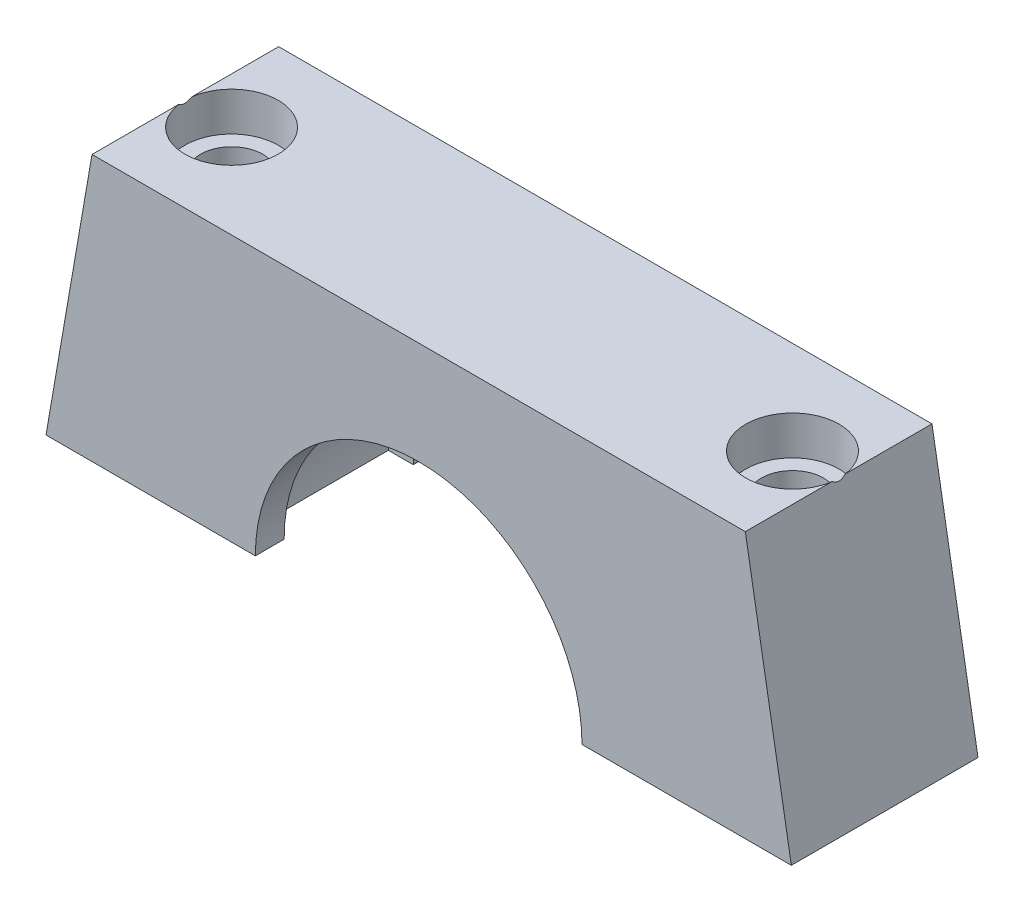
ISO-10303-21;
HEADER;
FILE_DESCRIPTION(('STEP AP214'),'2;1');
FILE_NAME('part.step','',(''),(''),'','','');
FILE_SCHEMA(('AUTOMOTIVE_DESIGN { 1 0 10303 214 1 1 1 1 }'));
ENDSEC;
DATA;
#1=APPLICATION_CONTEXT('core data for automotive mechanical design processes');
#2=APPLICATION_PROTOCOL_DEFINITION('international standard','automotive_design',2000,#1);
#3=PRODUCT_CONTEXT('',#1,'mechanical');
#4=PRODUCT('Part','Part','',(#3));
#5=PRODUCT_RELATED_PRODUCT_CATEGORY('part','',(#4));
#6=PRODUCT_DEFINITION_FORMATION('','',#4);
#7=PRODUCT_DEFINITION_CONTEXT('part definition',#1,'design');
#8=PRODUCT_DEFINITION('design','',#6,#7);
#9=PRODUCT_DEFINITION_SHAPE('','',#8);
#10=(LENGTH_UNIT() NAMED_UNIT(*) SI_UNIT(.MILLI.,.METRE.));
#11=(NAMED_UNIT(*) PLANE_ANGLE_UNIT() SI_UNIT($,.RADIAN.));
#12=(NAMED_UNIT(*) SI_UNIT($,.STERADIAN.) SOLID_ANGLE_UNIT());
#13=UNCERTAINTY_MEASURE_WITH_UNIT(LENGTH_MEASURE(1.E-05),#10,'distance_accuracy_value','');
#14=(GEOMETRIC_REPRESENTATION_CONTEXT(3) GLOBAL_UNCERTAINTY_ASSIGNED_CONTEXT((#13)) GLOBAL_UNIT_ASSIGNED_CONTEXT((#10,
#11,#12)) REPRESENTATION_CONTEXT('',''));
#15=CARTESIAN_POINT('',(0.,0.,0.));
#16=DIRECTION('',(0.,0.,1.));
#17=DIRECTION('',(1.,0.,0.));
#18=AXIS2_PLACEMENT_3D('',#15,#16,#17);
#19=CARTESIAN_POINT('',(0.,0.,12.));
#20=DIRECTION('',(0.,0.,-1.));
#21=DIRECTION('',(-1.,0.,0.));
#22=AXIS2_PLACEMENT_3D('',#19,#20,#21);
#23=CYLINDRICAL_SURFACE('',#22,12.1);
#24=DIRECTION('',(0.,0.,-1.));
#25=VECTOR('',#24,1.);
#26=CARTESIAN_POINT('',(-12.1,0.,12.));
#27=LINE('',#26,#25);
#28=CARTESIAN_POINT('',(-12.1,0.,10.15));
#29=VERTEX_POINT('',#28);
#30=CARTESIAN_POINT('',(-12.1,0.,1.85));
#31=VERTEX_POINT('',#30);
#32=EDGE_CURVE('E244',#29,#31,#27,.T.);
#33=ORIENTED_EDGE('',*,*,#32,.T.);
#34=CARTESIAN_POINT('',(0.,0.,1.85));
#35=DIRECTION('',(0.,0.,-1.));
#36=DIRECTION('',(-1.,0.,0.));
#37=AXIS2_PLACEMENT_3D('',#34,#35,#36);
#38=CIRCLE('',#37,12.1);
#39=CARTESIAN_POINT('',(12.1,0.,1.85));
#40=VERTEX_POINT('',#39);
#41=EDGE_CURVE('E147',#31,#40,#38,.T.);
#42=ORIENTED_EDGE('',*,*,#41,.T.);
#43=DIRECTION('',(0.,0.,-1.));
#44=VECTOR('',#43,1.);
#45=CARTESIAN_POINT('',(12.1,0.,12.));
#46=LINE('',#45,#44);
#47=CARTESIAN_POINT('',(12.1,0.,10.15));
#48=VERTEX_POINT('',#47);
#49=EDGE_CURVE('E49',#48,#40,#46,.T.);
#50=ORIENTED_EDGE('',*,*,#49,.F.);
#51=CARTESIAN_POINT('',(0.,0.,10.15));
#52=DIRECTION('',(0.,0.,1.));
#53=DIRECTION('',(1.,0.,0.));
#54=AXIS2_PLACEMENT_3D('',#51,#52,#53);
#55=CIRCLE('',#54,12.1);
#56=EDGE_CURVE('E59',#29,#48,#55,.F.);
#57=ORIENTED_EDGE('',*,*,#56,.F.);
#58=EDGE_LOOP('',(#33,#42,#50,#57));
#59=FACE_BOUND('',#58,.T.);
#60=ADVANCED_FACE('F41',(#59),#23,.F.);
#61=CARTESIAN_POINT('',(-18.0287735849057,17.1,6.));
#62=DIRECTION('',(0.,-1.,0.));
#63=DIRECTION('',(1.,0.,0.));
#64=AXIS2_PLACEMENT_3D('',#61,#62,#63);
#65=CYLINDRICAL_SURFACE('',#64,2.);
#66=CARTESIAN_POINT('',(-18.0287735849057,0.,6.));
#67=DIRECTION('',(0.,-1.,0.));
#68=DIRECTION('',(1.,0.,0.));
#69=AXIS2_PLACEMENT_3D('',#66,#67,#68);
#70=CIRCLE('',#69,2.);
#71=CARTESIAN_POINT('',(-16.0287735849057,0.,6.));
#72=VERTEX_POINT('',#71);
#73=EDGE_CURVE('E206',#72,#72,#70,.T.);
#74=ORIENTED_EDGE('',*,*,#73,.T.);
#75=EDGE_LOOP('',(#74));
#76=FACE_BOUND('',#75,.T.);
#77=CARTESIAN_POINT('',(-18.0287735849057,14.6,6.));
#78=DIRECTION('',(0.,1.,0.));
#79=DIRECTION('',(-1.,0.,0.));
#80=AXIS2_PLACEMENT_3D('',#77,#78,#79);
#81=CIRCLE('',#80,2.);
#82=CARTESIAN_POINT('',(-20.0287735849057,14.6,6.));
#83=VERTEX_POINT('',#82);
#84=EDGE_CURVE('E205',#83,#83,#81,.F.);
#85=ORIENTED_EDGE('',*,*,#84,.F.);
#86=EDGE_LOOP('',(#85));
#87=FACE_BOUND('',#86,.T.);
#88=ADVANCED_FACE('F273',(#76,#87),#65,.F.);
#89=CARTESIAN_POINT('',(18.0287735849057,17.1,6.));
#90=DIRECTION('',(0.,-1.,0.));
#91=DIRECTION('',(1.,0.,0.));
#92=AXIS2_PLACEMENT_3D('',#89,#90,#91);
#93=CYLINDRICAL_SURFACE('',#92,2.);
#94=CARTESIAN_POINT('',(18.0287735849057,0.,6.));
#95=DIRECTION('',(0.,-1.,0.));
#96=DIRECTION('',(1.,0.,0.));
#97=AXIS2_PLACEMENT_3D('',#94,#95,#96);
#98=CIRCLE('',#97,2.);
#99=CARTESIAN_POINT('',(20.0287735849057,0.,6.));
#100=VERTEX_POINT('',#99);
#101=EDGE_CURVE('E204',#100,#100,#98,.T.);
#102=ORIENTED_EDGE('',*,*,#101,.T.);
#103=EDGE_LOOP('',(#102));
#104=FACE_BOUND('',#103,.T.);
#105=CARTESIAN_POINT('',(18.0287735849057,14.6,6.));
#106=DIRECTION('',(0.,1.,0.));
#107=DIRECTION('',(-1.,0.,0.));
#108=AXIS2_PLACEMENT_3D('',#105,#106,#107);
#109=CIRCLE('',#108,2.);
#110=CARTESIAN_POINT('',(16.0287735849057,14.6,6.));
#111=VERTEX_POINT('',#110);
#112=EDGE_CURVE('E191',#111,#111,#109,.F.);
#113=ORIENTED_EDGE('',*,*,#112,.F.);
#114=EDGE_LOOP('',(#113));
#115=FACE_BOUND('',#114,.T.);
#116=ADVANCED_FACE('F275',(#104,#115),#93,.F.);
#117=CARTESIAN_POINT('',(0.,0.,12.));
#118=DIRECTION('',(0.,1.,0.));
#119=DIRECTION('',(-1.,0.,0.));
#120=AXIS2_PLACEMENT_3D('',#117,#118,#119);
#121=PLANE('',#120);
#122=ORIENTED_EDGE('',*,*,#101,.F.);
#123=EDGE_LOOP('',(#122));
#124=FACE_BOUND('',#123,.T.);
#125=DIRECTION('',(1.,0.,0.));
#126=VECTOR('',#125,1.);
#127=CARTESIAN_POINT('',(0.,0.,0.));
#128=LINE('',#127,#126);
#129=CARTESIAN_POINT('',(10.5,0.,0.));
#130=VERTEX_POINT('',#129);
#131=CARTESIAN_POINT('',(23.9575471698113,0.,0.));
#132=VERTEX_POINT('',#131);
#133=EDGE_CURVE('E210',#130,#132,#128,.T.);
#134=ORIENTED_EDGE('',*,*,#133,.T.);
#135=DIRECTION('',(0.,0.,-1.));
#136=VECTOR('',#135,1.);
#137=CARTESIAN_POINT('',(23.9575471698113,0.,12.));
#138=LINE('',#137,#136);
#139=CARTESIAN_POINT('',(23.9575471698113,0.,12.));
#140=VERTEX_POINT('',#139);
#141=EDGE_CURVE('E260',#140,#132,#138,.T.);
#142=ORIENTED_EDGE('',*,*,#141,.F.);
#143=DIRECTION('',(1.,0.,0.));
#144=VECTOR('',#143,1.);
#145=CARTESIAN_POINT('',(0.,0.,12.));
#146=LINE('',#145,#144);
#147=CARTESIAN_POINT('',(10.5,0.,12.));
#148=VERTEX_POINT('',#147);
#149=EDGE_CURVE('E214',#148,#140,#146,.T.);
#150=ORIENTED_EDGE('',*,*,#149,.F.);
#151=DIRECTION('',(0.,0.,1.));
#152=VECTOR('',#151,1.);
#153=CARTESIAN_POINT('',(10.5,0.,10.15));
#154=LINE('',#153,#152);
#155=CARTESIAN_POINT('',(10.5,0.,10.15));
#156=VERTEX_POINT('',#155);
#157=EDGE_CURVE('E183',#156,#148,#154,.T.);
#158=ORIENTED_EDGE('',*,*,#157,.F.);
#159=DIRECTION('',(1.,0.,0.));
#160=VECTOR('',#159,1.);
#161=CARTESIAN_POINT('',(0.,0.,10.15));
#162=LINE('',#161,#160);
#163=EDGE_CURVE('E168',#156,#48,#162,.T.);
#164=ORIENTED_EDGE('',*,*,#163,.T.);
#165=ORIENTED_EDGE('',*,*,#49,.T.);
#166=DIRECTION('',(-1.,0.,0.));
#167=VECTOR('',#166,1.);
#168=CARTESIAN_POINT('',(12.1,0.,1.85));
#169=LINE('',#168,#167);
#170=CARTESIAN_POINT('',(10.5,0.,1.85));
#171=VERTEX_POINT('',#170);
#172=EDGE_CURVE('E140',#40,#171,#169,.T.);
#173=ORIENTED_EDGE('',*,*,#172,.T.);
#174=DIRECTION('',(0.,0.,-1.));
#175=VECTOR('',#174,1.);
#176=CARTESIAN_POINT('',(10.5,0.,1.85));
#177=LINE('',#176,#175);
#178=EDGE_CURVE('E139',#171,#130,#177,.T.);
#179=ORIENTED_EDGE('',*,*,#178,.T.);
#180=EDGE_LOOP('',(#134,#142,#150,#158,#164,#165,#173,#179));
#181=FACE_BOUND('',#180,.T.);
#182=ADVANCED_FACE('F282',(#124,#181),#121,.F.);
#183=CARTESIAN_POINT('',(23.2617019846566,4.02325034325822,12.));
#184=DIRECTION('',(0.985370526239012,0.170425719946999,0.));
#185=DIRECTION('',(-0.170425719946999,0.985370526239012,0.));
#186=AXIS2_PLACEMENT_3D('',#183,#184,#185);
#187=PLANE('',#186);
#188=CARTESIAN_POINT('',(18.0287735849057,34.279090909091,6.));
#189=DIRECTION('',(0.985370526239012,0.170425719946999,0.));
#190=DIRECTION('',(-0.170425719946999,0.985370526239012,0.));
#191=AXIS2_PLACEMENT_3D('',#188,#189,#190);
#192=ELLIPSE('',#191,17.6029768331504,3.);
#193=CARTESIAN_POINT('',(21.,17.1,6.41450402922721));
#194=VERTEX_POINT('',#193);
#195=CARTESIAN_POINT('',(21.,17.1,5.58549597077279));
#196=VERTEX_POINT('',#195);
#197=EDGE_CURVE('E201',#194,#196,#192,.T.);
#198=ORIENTED_EDGE('',*,*,#197,.F.);
#199=DIRECTION('',(0.,0.,-1.));
#200=VECTOR('',#199,1.);
#201=CARTESIAN_POINT('',(21.,17.1,12.));
#202=LINE('',#201,#200);
#203=CARTESIAN_POINT('',(21.,17.1,12.));
#204=VERTEX_POINT('',#203);
#205=EDGE_CURVE('E256',#204,#194,#202,.T.);
#206=ORIENTED_EDGE('',*,*,#205,.F.);
#207=DIRECTION('',(0.170425719946999,-0.985370526239012,0.));
#208=VECTOR('',#207,1.);
#209=CARTESIAN_POINT('',(23.2617019846566,4.02325034325822,12.));
#210=LINE('',#209,#208);
#211=EDGE_CURVE('E217',#204,#140,#210,.T.);
#212=ORIENTED_EDGE('',*,*,#211,.T.);
#213=ORIENTED_EDGE('',*,*,#141,.T.);
#214=DIRECTION('',(0.170425719946999,-0.985370526239012,0.));
#215=VECTOR('',#214,1.);
#216=CARTESIAN_POINT('',(23.2617019846566,4.02325034325822,0.));
#217=LINE('',#216,#215);
#218=CARTESIAN_POINT('',(21.,17.1,0.));
#219=VERTEX_POINT('',#218);
#220=EDGE_CURVE('E232',#219,#132,#217,.T.);
#221=ORIENTED_EDGE('',*,*,#220,.F.);
#222=EDGE_CURVE('E255',#196,#219,#202,.T.);
#223=ORIENTED_EDGE('',*,*,#222,.F.);
#224=EDGE_LOOP('',(#198,#206,#212,#213,#221,#223));
#225=FACE_BOUND('',#224,.T.);
#226=ADVANCED_FACE('F307',(#225),#187,.T.);
#227=CARTESIAN_POINT('',(0.,17.1,12.));
#228=DIRECTION('',(0.,-1.,0.));
#229=DIRECTION('',(1.,0.,0.));
#230=AXIS2_PLACEMENT_3D('',#227,#228,#229);
#231=PLANE('',#230);
#232=DIRECTION('',(0.,0.,-1.));
#233=VECTOR('',#232,1.);
#234=CARTESIAN_POINT('',(-21.,17.1,12.));
#235=LINE('',#234,#233);
#236=CARTESIAN_POINT('',(-21.,17.1,5.5854959707727));
#237=VERTEX_POINT('',#236);
#238=CARTESIAN_POINT('',(-21.,17.1,0.));
#239=VERTEX_POINT('',#238);
#240=EDGE_CURVE('E250',#237,#239,#235,.T.);
#241=ORIENTED_EDGE('',*,*,#240,.F.);
#242=CARTESIAN_POINT('',(-18.0287735849057,17.1,6.));
#243=DIRECTION('',(0.,1.,0.));
#244=DIRECTION('',(-1.,0.,0.));
#245=AXIS2_PLACEMENT_3D('',#242,#243,#244);
#246=CIRCLE('',#245,3.);
#247=CARTESIAN_POINT('',(-21.,17.1,6.4145040292273));
#248=VERTEX_POINT('',#247);
#249=EDGE_CURVE('E192',#248,#237,#246,.T.);
#250=ORIENTED_EDGE('',*,*,#249,.F.);
#251=CARTESIAN_POINT('',(-21.,17.1,12.));
#252=VERTEX_POINT('',#251);
#253=EDGE_CURVE('E251',#252,#248,#235,.T.);
#254=ORIENTED_EDGE('',*,*,#253,.F.);
#255=DIRECTION('',(-1.,0.,0.));
#256=VECTOR('',#255,1.);
#257=CARTESIAN_POINT('',(0.,17.1,12.));
#258=LINE('',#257,#256);
#259=EDGE_CURVE('E222',#204,#252,#258,.T.);
#260=ORIENTED_EDGE('',*,*,#259,.F.);
#261=ORIENTED_EDGE('',*,*,#205,.T.);
#262=CARTESIAN_POINT('',(18.0287735849057,17.1,6.));
#263=DIRECTION('',(0.,1.,0.));
#264=DIRECTION('',(-1.,0.,0.));
#265=AXIS2_PLACEMENT_3D('',#262,#263,#264);
#266=CIRCLE('',#265,3.);
#267=EDGE_CURVE('E182',#196,#194,#266,.T.);
#268=ORIENTED_EDGE('',*,*,#267,.F.);
#269=ORIENTED_EDGE('',*,*,#222,.T.);
#270=DIRECTION('',(-1.,0.,0.));
#271=VECTOR('',#270,1.);
#272=CARTESIAN_POINT('',(0.,17.1,0.));
#273=LINE('',#272,#271);
#274=EDGE_CURVE('E236',#219,#239,#273,.T.);
#275=ORIENTED_EDGE('',*,*,#274,.T.);
#276=EDGE_LOOP('',(#241,#250,#254,#260,#261,#268,#269,#275));
#277=FACE_BOUND('',#276,.T.);
#278=ADVANCED_FACE('F304',(#277),#231,.F.);
#279=CARTESIAN_POINT('',(-23.2617019846566,4.02325034325822,12.));
#280=DIRECTION('',(-0.985370526239012,0.170425719946999,0.));
#281=DIRECTION('',(-0.170425719946999,-0.985370526239012,0.));
#282=AXIS2_PLACEMENT_3D('',#279,#280,#281);
#283=PLANE('',#282);
#284=CARTESIAN_POINT('',(-18.0287735849057,34.2790909090908,6.));
#285=DIRECTION('',(-0.985370526239012,0.170425719946999,0.));
#286=DIRECTION('',(0.170425719946999,0.985370526239012,0.));
#287=AXIS2_PLACEMENT_3D('',#284,#285,#286);
#288=ELLIPSE('',#287,17.6029768331504,3.);
#289=EDGE_CURVE('E11',#237,#248,#288,.T.);
#290=ORIENTED_EDGE('',*,*,#289,.F.);
#291=ORIENTED_EDGE('',*,*,#240,.T.);
#292=DIRECTION('',(0.170425719946999,0.985370526239012,0.));
#293=VECTOR('',#292,1.);
#294=CARTESIAN_POINT('',(-23.2617019846566,4.02325034325822,0.));
#295=LINE('',#294,#293);
#296=CARTESIAN_POINT('',(-23.9575471698113,0.,0.));
#297=VERTEX_POINT('',#296);
#298=EDGE_CURVE('E240',#297,#239,#295,.T.);
#299=ORIENTED_EDGE('',*,*,#298,.F.);
#300=DIRECTION('',(0.,0.,-1.));
#301=VECTOR('',#300,1.);
#302=CARTESIAN_POINT('',(-23.9575471698113,0.,12.));
#303=LINE('',#302,#301);
#304=CARTESIAN_POINT('',(-23.9575471698113,0.,12.));
#305=VERTEX_POINT('',#304);
#306=EDGE_CURVE('E247',#305,#297,#303,.T.);
#307=ORIENTED_EDGE('',*,*,#306,.F.);
#308=DIRECTION('',(0.170425719946999,0.985370526239012,0.));
#309=VECTOR('',#308,1.);
#310=CARTESIAN_POINT('',(-23.2617019846566,4.02325034325822,12.));
#311=LINE('',#310,#309);
#312=EDGE_CURVE('E225',#305,#252,#311,.T.);
#313=ORIENTED_EDGE('',*,*,#312,.T.);
#314=ORIENTED_EDGE('',*,*,#253,.T.);
#315=EDGE_LOOP('',(#290,#291,#299,#307,#313,#314));
#316=FACE_BOUND('',#315,.T.);
#317=ADVANCED_FACE('F300',(#316),#283,.T.);
#318=ORIENTED_EDGE('',*,*,#73,.F.);
#319=EDGE_LOOP('',(#318));
#320=FACE_BOUND('',#319,.T.);
#321=CARTESIAN_POINT('',(-10.5,0.,0.));
#322=VERTEX_POINT('',#321);
#323=EDGE_CURVE('E133',#297,#322,#128,.T.);
#324=ORIENTED_EDGE('',*,*,#323,.T.);
#325=DIRECTION('',(0.,0.,-1.));
#326=VECTOR('',#325,1.);
#327=CARTESIAN_POINT('',(-10.5,0.,1.85));
#328=LINE('',#327,#326);
#329=CARTESIAN_POINT('',(-10.5,0.,1.85));
#330=VERTEX_POINT('',#329);
#331=EDGE_CURVE('E128',#330,#322,#328,.T.);
#332=ORIENTED_EDGE('',*,*,#331,.F.);
#333=DIRECTION('',(-1.,0.,0.));
#334=VECTOR('',#333,1.);
#335=CARTESIAN_POINT('',(-10.5,0.,1.85));
#336=LINE('',#335,#334);
#337=EDGE_CURVE('E131',#330,#31,#336,.T.);
#338=ORIENTED_EDGE('',*,*,#337,.T.);
#339=ORIENTED_EDGE('',*,*,#32,.F.);
#340=CARTESIAN_POINT('',(-10.5,0.,10.15));
#341=VERTEX_POINT('',#340);
#342=EDGE_CURVE('E172',#29,#341,#162,.T.);
#343=ORIENTED_EDGE('',*,*,#342,.T.);
#344=DIRECTION('',(0.,0.,1.));
#345=VECTOR('',#344,1.);
#346=CARTESIAN_POINT('',(-10.5,0.,10.15));
#347=LINE('',#346,#345);
#348=CARTESIAN_POINT('',(-10.5,0.,12.));
#349=VERTEX_POINT('',#348);
#350=EDGE_CURVE('E178',#341,#349,#347,.T.);
#351=ORIENTED_EDGE('',*,*,#350,.T.);
#352=EDGE_CURVE('E218',#305,#349,#146,.T.);
#353=ORIENTED_EDGE('',*,*,#352,.F.);
#354=ORIENTED_EDGE('',*,*,#306,.T.);
#355=EDGE_LOOP('',(#324,#332,#338,#339,#343,#351,#353,#354));
#356=FACE_BOUND('',#355,.T.);
#357=ADVANCED_FACE('F130',(#320,#356),#121,.F.);
#358=CARTESIAN_POINT('',(0.,0.,12.));
#359=DIRECTION('',(0.,0.,1.));
#360=DIRECTION('',(1.,0.,0.));
#361=AXIS2_PLACEMENT_3D('',#358,#359,#360);
#362=PLANE('',#361);
#363=ORIENTED_EDGE('',*,*,#352,.T.);
#364=CARTESIAN_POINT('',(0.,0.,12.));
#365=DIRECTION('',(0.,0.,1.));
#366=DIRECTION('',(1.,0.,0.));
#367=AXIS2_PLACEMENT_3D('',#364,#365,#366);
#368=CIRCLE('',#367,10.5);
#369=EDGE_CURVE('E163',#148,#349,#368,.T.);
#370=ORIENTED_EDGE('',*,*,#369,.F.);
#371=ORIENTED_EDGE('',*,*,#149,.T.);
#372=ORIENTED_EDGE('',*,*,#211,.F.);
#373=ORIENTED_EDGE('',*,*,#259,.T.);
#374=ORIENTED_EDGE('',*,*,#312,.F.);
#375=EDGE_LOOP('',(#363,#370,#371,#372,#373,#374));
#376=FACE_BOUND('',#375,.T.);
#377=ADVANCED_FACE('F289',(#376),#362,.T.);
#378=CARTESIAN_POINT('',(0.,0.,0.));
#379=DIRECTION('',(0.,0.,1.));
#380=DIRECTION('',(1.,0.,0.));
#381=AXIS2_PLACEMENT_3D('',#378,#379,#380);
#382=PLANE('',#381);
#383=ORIENTED_EDGE('',*,*,#133,.F.);
#384=CARTESIAN_POINT('',(0.,0.,0.));
#385=DIRECTION('',(0.,0.,1.));
#386=DIRECTION('',(-1.,0.,0.));
#387=AXIS2_PLACEMENT_3D('',#384,#385,#386);
#388=CIRCLE('',#387,10.5);
#389=EDGE_CURVE('E153',#130,#322,#388,.T.);
#390=ORIENTED_EDGE('',*,*,#389,.T.);
#391=ORIENTED_EDGE('',*,*,#323,.F.);
#392=ORIENTED_EDGE('',*,*,#298,.T.);
#393=ORIENTED_EDGE('',*,*,#274,.F.);
#394=ORIENTED_EDGE('',*,*,#220,.T.);
#395=EDGE_LOOP('',(#383,#390,#391,#392,#393,#394));
#396=FACE_BOUND('',#395,.T.);
#397=ADVANCED_FACE('F292',(#396),#382,.F.);
#398=CARTESIAN_POINT('',(18.0287735849057,14.6,6.));
#399=DIRECTION('',(0.,1.,0.));
#400=DIRECTION('',(-1.,0.,0.));
#401=AXIS2_PLACEMENT_3D('',#398,#399,#400);
#402=PLANE('',#401);
#403=CARTESIAN_POINT('',(18.0287735849057,14.6,6.));
#404=DIRECTION('',(0.,1.,0.));
#405=DIRECTION('',(-1.,0.,0.));
#406=AXIS2_PLACEMENT_3D('',#403,#404,#405);
#407=CIRCLE('',#406,3.);
#408=CARTESIAN_POINT('',(15.0287735849057,14.6,6.));
#409=VERTEX_POINT('',#408);
#410=EDGE_CURVE('E195',#409,#409,#407,.T.);
#411=ORIENTED_EDGE('',*,*,#410,.T.);
#412=EDGE_LOOP('',(#411));
#413=FACE_BOUND('',#412,.T.);
#414=ORIENTED_EDGE('',*,*,#112,.T.);
#415=EDGE_LOOP('',(#414));
#416=FACE_BOUND('',#415,.T.);
#417=ADVANCED_FACE('F296',(#413,#416),#402,.T.);
#418=CARTESIAN_POINT('',(18.0287735849057,14.6,6.));
#419=DIRECTION('',(0.,1.,0.));
#420=DIRECTION('',(-1.,0.,0.));
#421=AXIS2_PLACEMENT_3D('',#418,#419,#420);
#422=CYLINDRICAL_SURFACE('',#421,3.);
#423=ORIENTED_EDGE('',*,*,#197,.T.);
#424=ORIENTED_EDGE('',*,*,#267,.T.);
#425=EDGE_LOOP('',(#423,#424));
#426=FACE_BOUND('',#425,.T.);
#427=ORIENTED_EDGE('',*,*,#410,.F.);
#428=EDGE_LOOP('',(#427));
#429=FACE_BOUND('',#428,.T.);
#430=ADVANCED_FACE('F286',(#426,#429),#422,.F.);
#431=CARTESIAN_POINT('',(-18.0287735849057,14.6,6.));
#432=DIRECTION('',(0.,1.,0.));
#433=DIRECTION('',(-1.,0.,0.));
#434=AXIS2_PLACEMENT_3D('',#431,#432,#433);
#435=PLANE('',#434);
#436=CARTESIAN_POINT('',(-18.0287735849057,14.6,6.));
#437=DIRECTION('',(0.,1.,0.));
#438=DIRECTION('',(-1.,0.,0.));
#439=AXIS2_PLACEMENT_3D('',#436,#437,#438);
#440=CIRCLE('',#439,3.);
#441=CARTESIAN_POINT('',(-21.0287735849057,14.6,6.));
#442=VERTEX_POINT('',#441);
#443=EDGE_CURVE('E187',#442,#442,#440,.T.);
#444=ORIENTED_EDGE('',*,*,#443,.T.);
#445=EDGE_LOOP('',(#444));
#446=FACE_BOUND('',#445,.T.);
#447=ORIENTED_EDGE('',*,*,#84,.T.);
#448=EDGE_LOOP('',(#447));
#449=FACE_BOUND('',#448,.T.);
#450=ADVANCED_FACE('F271',(#446,#449),#435,.T.);
#451=CARTESIAN_POINT('',(-18.0287735849057,14.6,6.));
#452=DIRECTION('',(0.,1.,0.));
#453=DIRECTION('',(-1.,0.,0.));
#454=AXIS2_PLACEMENT_3D('',#451,#452,#453);
#455=CYLINDRICAL_SURFACE('',#454,3.);
#456=ORIENTED_EDGE('',*,*,#289,.T.);
#457=ORIENTED_EDGE('',*,*,#249,.T.);
#458=EDGE_LOOP('',(#456,#457));
#459=FACE_BOUND('',#458,.T.);
#460=ORIENTED_EDGE('',*,*,#443,.F.);
#461=EDGE_LOOP('',(#460));
#462=FACE_BOUND('',#461,.T.);
#463=ADVANCED_FACE('F353',(#459,#462),#455,.F.);
#464=CARTESIAN_POINT('',(0.,0.,10.15));
#465=DIRECTION('',(0.,0.,1.));
#466=DIRECTION('',(1.,0.,0.));
#467=AXIS2_PLACEMENT_3D('',#464,#465,#466);
#468=CYLINDRICAL_SURFACE('',#467,10.5);
#469=ORIENTED_EDGE('',*,*,#369,.T.);
#470=ORIENTED_EDGE('',*,*,#350,.F.);
#471=CARTESIAN_POINT('',(0.,0.,10.15));
#472=DIRECTION('',(0.,0.,1.));
#473=DIRECTION('',(1.,0.,0.));
#474=AXIS2_PLACEMENT_3D('',#471,#472,#473);
#475=CIRCLE('',#474,10.5);
#476=EDGE_CURVE('E165',#156,#341,#475,.T.);
#477=ORIENTED_EDGE('',*,*,#476,.F.);
#478=ORIENTED_EDGE('',*,*,#157,.T.);
#479=EDGE_LOOP('',(#469,#470,#477,#478));
#480=FACE_BOUND('',#479,.T.);
#481=ADVANCED_FACE('F341',(#480),#468,.F.);
#482=CARTESIAN_POINT('',(0.,0.,10.15));
#483=DIRECTION('',(0.,0.,1.));
#484=DIRECTION('',(1.,0.,0.));
#485=AXIS2_PLACEMENT_3D('',#482,#483,#484);
#486=PLANE('',#485);
#487=ORIENTED_EDGE('',*,*,#476,.T.);
#488=ORIENTED_EDGE('',*,*,#342,.F.);
#489=ORIENTED_EDGE('',*,*,#56,.T.);
#490=ORIENTED_EDGE('',*,*,#163,.F.);
#491=EDGE_LOOP('',(#487,#488,#489,#490));
#492=FACE_BOUND('',#491,.T.);
#493=ADVANCED_FACE('F344',(#492),#486,.F.);
#494=CARTESIAN_POINT('',(0.,0.,1.85));
#495=DIRECTION('',(0.,0.,-1.));
#496=DIRECTION('',(-1.,0.,0.));
#497=AXIS2_PLACEMENT_3D('',#494,#495,#496);
#498=CYLINDRICAL_SURFACE('',#497,10.5);
#499=ORIENTED_EDGE('',*,*,#389,.F.);
#500=ORIENTED_EDGE('',*,*,#178,.F.);
#501=CARTESIAN_POINT('',(0.,0.,1.85));
#502=DIRECTION('',(0.,0.,1.));
#503=DIRECTION('',(-1.,0.,0.));
#504=AXIS2_PLACEMENT_3D('',#501,#502,#503);
#505=CIRCLE('',#504,10.5);
#506=EDGE_CURVE('E145',#171,#330,#505,.T.);
#507=ORIENTED_EDGE('',*,*,#506,.T.);
#508=ORIENTED_EDGE('',*,*,#331,.T.);
#509=EDGE_LOOP('',(#499,#500,#507,#508));
#510=FACE_BOUND('',#509,.T.);
#511=ADVANCED_FACE('F150',(#510),#498,.F.);
#512=CARTESIAN_POINT('',(0.,0.,1.85));
#513=DIRECTION('',(0.,0.,-1.));
#514=DIRECTION('',(-1.,0.,0.));
#515=AXIS2_PLACEMENT_3D('',#512,#513,#514);
#516=PLANE('',#515);
#517=ORIENTED_EDGE('',*,*,#506,.F.);
#518=ORIENTED_EDGE('',*,*,#172,.F.);
#519=ORIENTED_EDGE('',*,*,#41,.F.);
#520=ORIENTED_EDGE('',*,*,#337,.F.);
#521=EDGE_LOOP('',(#517,#518,#519,#520));
#522=FACE_BOUND('',#521,.T.);
#523=ADVANCED_FACE('F144',(#522),#516,.F.);
#524=CLOSED_SHELL('',(#60,#88,#116,#182,#226,#278,#317,#357,#377,#397,#417,#430,#450,#463,#481,
#493,#511,#523));
#525=MANIFOLD_SOLID_BREP('B2',#524);
#526=ADVANCED_BREP_SHAPE_REPRESENTATION('',(#18,#525),#14);
#527=SHAPE_DEFINITION_REPRESENTATION(#9,#526);
ENDSEC;
END-ISO-10303-21;
